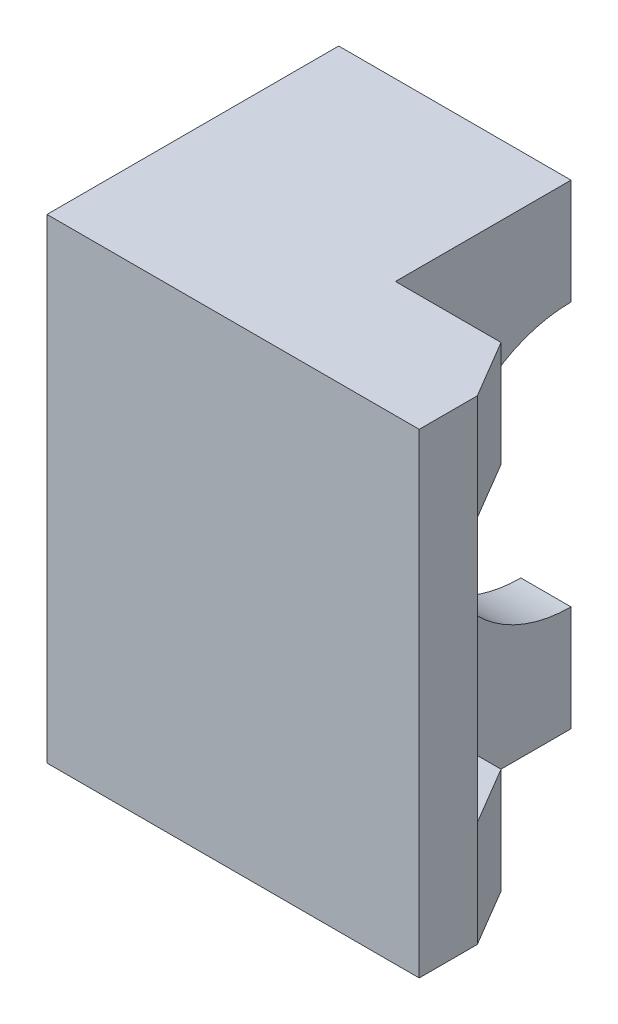
ISO-10303-21;
HEADER;
FILE_DESCRIPTION(('STEP AP214'),'2;1');
FILE_NAME('part.step','',(''),(''),'','','');
FILE_SCHEMA(('AUTOMOTIVE_DESIGN { 1 0 10303 214 1 1 1 1 }'));
ENDSEC;
DATA;
#1=APPLICATION_CONTEXT('core data for automotive mechanical design processes');
#2=APPLICATION_PROTOCOL_DEFINITION('international standard','automotive_design',2000,#1);
#3=PRODUCT_CONTEXT('',#1,'mechanical');
#4=PRODUCT('Part','Part','',(#3));
#5=PRODUCT_RELATED_PRODUCT_CATEGORY('part','',(#4));
#6=PRODUCT_DEFINITION_FORMATION('','',#4);
#7=PRODUCT_DEFINITION_CONTEXT('part definition',#1,'design');
#8=PRODUCT_DEFINITION('design','',#6,#7);
#9=PRODUCT_DEFINITION_SHAPE('','',#8);
#10=(LENGTH_UNIT() NAMED_UNIT(*) SI_UNIT(.MILLI.,.METRE.));
#11=(NAMED_UNIT(*) PLANE_ANGLE_UNIT() SI_UNIT($,.RADIAN.));
#12=(NAMED_UNIT(*) SI_UNIT($,.STERADIAN.) SOLID_ANGLE_UNIT());
#13=UNCERTAINTY_MEASURE_WITH_UNIT(LENGTH_MEASURE(1.E-05),#10,'distance_accuracy_value','');
#14=(GEOMETRIC_REPRESENTATION_CONTEXT(3) GLOBAL_UNCERTAINTY_ASSIGNED_CONTEXT((#13)) GLOBAL_UNIT_ASSIGNED_CONTEXT((#10,
#11,#12)) REPRESENTATION_CONTEXT('',''));
#15=CARTESIAN_POINT('',(0.,0.,0.));
#16=DIRECTION('',(0.,0.,1.));
#17=DIRECTION('',(1.,0.,0.));
#18=AXIS2_PLACEMENT_3D('',#15,#16,#17);
#19=CARTESIAN_POINT('',(70.5,90.,-11.));
#20=DIRECTION('',(-0.860926528214316,0.,0.508729312126641));
#21=DIRECTION('',(0.508729312126641,0.,0.860926528214316));
#22=AXIS2_PLACEMENT_3D('',#19,#20,#21);
#23=PLANE('',#22);
#24=DIRECTION('',(0.508729312126641,0.,0.860926528214316));
#25=VECTOR('',#24,1.);
#26=CARTESIAN_POINT('',(70.5,70.,-11.));
#27=LINE('',#26,#25);
#28=CARTESIAN_POINT('',(64.,70.,-22.));
#29=VERTEX_POINT('',#28);
#30=CARTESIAN_POINT('',(70.5,70.,-11.));
#31=VERTEX_POINT('',#30);
#32=EDGE_CURVE('E11',#29,#31,#27,.T.);
#33=ORIENTED_EDGE('',*,*,#32,.F.);
#34=DIRECTION('',(0.,-1.,0.));
#35=VECTOR('',#34,1.);
#36=CARTESIAN_POINT('',(64.,90.,-22.));
#37=LINE('',#36,#35);
#38=CARTESIAN_POINT('',(64.,90.,-22.));
#39=VERTEX_POINT('',#38);
#40=EDGE_CURVE('E214',#39,#29,#37,.T.);
#41=ORIENTED_EDGE('',*,*,#40,.F.);
#42=DIRECTION('',(-0.508729312126641,0.,-0.860926528214316));
#43=VECTOR('',#42,1.);
#44=CARTESIAN_POINT('',(70.5,90.,-11.));
#45=LINE('',#44,#43);
#46=CARTESIAN_POINT('',(70.5,90.,-11.));
#47=VERTEX_POINT('',#46);
#48=EDGE_CURVE('E324',#47,#39,#45,.T.);
#49=ORIENTED_EDGE('',*,*,#48,.F.);
#50=DIRECTION('',(0.,-1.,0.));
#51=VECTOR('',#50,1.);
#52=CARTESIAN_POINT('',(70.5,90.,-11.));
#53=LINE('',#52,#51);
#54=EDGE_CURVE('E212',#47,#31,#53,.T.);
#55=ORIENTED_EDGE('',*,*,#54,.T.);
#56=EDGE_LOOP('',(#33,#41,#49,#55));
#57=FACE_BOUND('',#56,.T.);
#58=ADVANCED_FACE('F39',(#57),#23,.F.);
#59=DIRECTION('',(-0.508729312126641,0.,-0.860926528214316));
#60=VECTOR('',#59,1.);
#61=CARTESIAN_POINT('',(70.5,20.,-11.));
#62=LINE('',#61,#60);
#63=CARTESIAN_POINT('',(70.5,20.,-11.));
#64=VERTEX_POINT('',#63);
#65=CARTESIAN_POINT('',(64.,20.,-22.));
#66=VERTEX_POINT('',#65);
#67=EDGE_CURVE('E50',#64,#66,#62,.T.);
#68=ORIENTED_EDGE('',*,*,#67,.F.);
#69=CARTESIAN_POINT('',(70.5,0.,-11.));
#70=VERTEX_POINT('',#69);
#71=EDGE_CURVE('E202',#64,#70,#53,.T.);
#72=ORIENTED_EDGE('',*,*,#71,.T.);
#73=DIRECTION('',(-0.508729312126641,0.,-0.860926528214316));
#74=VECTOR('',#73,1.);
#75=CARTESIAN_POINT('',(70.5,0.,-11.));
#76=LINE('',#75,#74);
#77=CARTESIAN_POINT('',(64.,0.,-22.));
#78=VERTEX_POINT('',#77);
#79=EDGE_CURVE('E337',#70,#78,#76,.T.);
#80=ORIENTED_EDGE('',*,*,#79,.T.);
#81=EDGE_CURVE('E210',#66,#78,#37,.T.);
#82=ORIENTED_EDGE('',*,*,#81,.F.);
#83=EDGE_LOOP('',(#68,#72,#80,#82));
#84=FACE_BOUND('',#83,.T.);
#85=ADVANCED_FACE('F201',(#84),#23,.F.);
#86=CARTESIAN_POINT('',(202.719546783785,45.,-55.25));
#87=DIRECTION('',(-1.,0.,0.));
#88=DIRECTION('',(0.,0.,1.));
#89=AXIS2_PLACEMENT_3D('',#86,#87,#88);
#90=CYLINDRICAL_SURFACE('',#89,25.);
#91=CARTESIAN_POINT('',(9.50000000000001,45.,-55.25));
#92=DIRECTION('',(1.,0.,0.));
#93=DIRECTION('',(0.,1.,0.));
#94=AXIS2_PLACEMENT_3D('',#91,#92,#93);
#95=CIRCLE('',#94,25.);
#96=CARTESIAN_POINT('',(9.5,65.,-40.25));
#97=VERTEX_POINT('',#96);
#98=CARTESIAN_POINT('',(9.50000000000001,70.,-55.25));
#99=VERTEX_POINT('',#98);
#100=EDGE_CURVE('E249',#97,#99,#95,.F.);
#101=ORIENTED_EDGE('',*,*,#100,.F.);
#102=DIRECTION('',(-1.,0.,0.));
#103=VECTOR('',#102,1.);
#104=CARTESIAN_POINT('',(202.719546783785,65.,-40.25));
#105=LINE('',#104,#103);
#106=CARTESIAN_POINT('',(34.5,65.,-40.25));
#107=VERTEX_POINT('',#106);
#108=EDGE_CURVE('E243',#97,#107,#105,.F.);
#109=ORIENTED_EDGE('',*,*,#108,.T.);
#110=CARTESIAN_POINT('',(34.5,45.,-55.25));
#111=DIRECTION('',(1.,0.,0.));
#112=DIRECTION('',(0.,0.,-1.));
#113=AXIS2_PLACEMENT_3D('',#110,#111,#112);
#114=CIRCLE('',#113,25.);
#115=CARTESIAN_POINT('',(34.5,70.,-55.25));
#116=VERTEX_POINT('',#115);
#117=EDGE_CURVE('E244',#107,#116,#114,.F.);
#118=ORIENTED_EDGE('',*,*,#117,.T.);
#119=DIRECTION('',(-1.,0.,0.));
#120=VECTOR('',#119,1.);
#121=CARTESIAN_POINT('',(202.719546783785,70.,-55.25));
#122=LINE('',#121,#120);
#123=CARTESIAN_POINT('',(44.,70.,-55.25));
#124=VERTEX_POINT('',#123);
#125=EDGE_CURVE('E303',#124,#116,#122,.T.);
#126=ORIENTED_EDGE('',*,*,#125,.F.);
#127=CARTESIAN_POINT('',(44.,45.,-55.25));
#128=DIRECTION('',(-1.,0.,0.));
#129=DIRECTION('',(0.,0.,1.));
#130=AXIS2_PLACEMENT_3D('',#127,#128,#129);
#131=CIRCLE('',#130,25.);
#132=CARTESIAN_POINT('',(44.,20.,-55.25));
#133=VERTEX_POINT('',#132);
#134=EDGE_CURVE('E283',#124,#133,#131,.F.);
#135=ORIENTED_EDGE('',*,*,#134,.T.);
#136=DIRECTION('',(-1.,0.,0.));
#137=VECTOR('',#136,1.);
#138=CARTESIAN_POINT('',(202.719546783785,20.,-55.25));
#139=LINE('',#138,#137);
#140=CARTESIAN_POINT('',(34.5,20.,-55.25));
#141=VERTEX_POINT('',#140);
#142=EDGE_CURVE('E310',#133,#141,#139,.T.);
#143=ORIENTED_EDGE('',*,*,#142,.T.);
#144=CARTESIAN_POINT('',(34.5,45.,-55.25));
#145=DIRECTION('',(-1.,0.,0.));
#146=DIRECTION('',(0.,0.,1.));
#147=AXIS2_PLACEMENT_3D('',#144,#145,#146);
#148=CIRCLE('',#147,25.);
#149=CARTESIAN_POINT('',(34.5,25.,-40.25));
#150=VERTEX_POINT('',#149);
#151=EDGE_CURVE('E239',#150,#141,#148,.F.);
#152=ORIENTED_EDGE('',*,*,#151,.F.);
#153=DIRECTION('',(-1.,0.,0.));
#154=VECTOR('',#153,1.);
#155=CARTESIAN_POINT('',(202.719546783785,25.,-40.25));
#156=LINE('',#155,#154);
#157=CARTESIAN_POINT('',(9.49999999999998,25.,-40.25));
#158=VERTEX_POINT('',#157);
#159=EDGE_CURVE('E231',#158,#150,#156,.F.);
#160=ORIENTED_EDGE('',*,*,#159,.F.);
#161=CARTESIAN_POINT('',(9.50000000000001,45.,-55.25));
#162=DIRECTION('',(-1.,0.,0.));
#163=DIRECTION('',(0.,-1.,0.));
#164=AXIS2_PLACEMENT_3D('',#161,#162,#163);
#165=CIRCLE('',#164,25.);
#166=CARTESIAN_POINT('',(9.50000000000001,20.,-55.25));
#167=VERTEX_POINT('',#166);
#168=EDGE_CURVE('E237',#158,#167,#165,.F.);
#169=ORIENTED_EDGE('',*,*,#168,.T.);
#170=CARTESIAN_POINT('',(0.,20.,-55.25));
#171=VERTEX_POINT('',#170);
#172=EDGE_CURVE('E306',#167,#171,#139,.T.);
#173=ORIENTED_EDGE('',*,*,#172,.T.);
#174=CARTESIAN_POINT('',(0.,45.,-55.25));
#175=DIRECTION('',(-1.,0.,0.));
#176=DIRECTION('',(0.,0.,1.));
#177=AXIS2_PLACEMENT_3D('',#174,#175,#176);
#178=CIRCLE('',#177,25.);
#179=CARTESIAN_POINT('',(0.,70.,-55.25));
#180=VERTEX_POINT('',#179);
#181=EDGE_CURVE('E297',#180,#171,#178,.F.);
#182=ORIENTED_EDGE('',*,*,#181,.F.);
#183=EDGE_CURVE('E305',#99,#180,#122,.T.);
#184=ORIENTED_EDGE('',*,*,#183,.F.);
#185=EDGE_LOOP('',(#101,#109,#118,#126,#135,#143,#152,#160,#169,#173,#182,#184));
#186=FACE_BOUND('',#185,.T.);
#187=ADVANCED_FACE('F365',(#186),#90,.F.);
#188=CARTESIAN_POINT('',(44.,90.,-55.25));
#189=DIRECTION('',(0.,0.,1.));
#190=DIRECTION('',(1.,0.,0.));
#191=AXIS2_PLACEMENT_3D('',#188,#189,#190);
#192=PLANE('',#191);
#193=DIRECTION('',(-1.,0.,0.));
#194=VECTOR('',#193,1.);
#195=CARTESIAN_POINT('',(34.5,11.5,-55.25));
#196=LINE('',#195,#194);
#197=CARTESIAN_POINT('',(34.5,11.5,-55.25));
#198=VERTEX_POINT('',#197);
#199=CARTESIAN_POINT('',(9.49999999999999,11.5,-55.25));
#200=VERTEX_POINT('',#199);
#201=EDGE_CURVE('E287',#198,#200,#196,.T.);
#202=ORIENTED_EDGE('',*,*,#201,.F.);
#203=DIRECTION('',(0.,1.,0.));
#204=VECTOR('',#203,1.);
#205=CARTESIAN_POINT('',(34.5,11.5,-55.25));
#206=LINE('',#205,#204);
#207=EDGE_CURVE('E273',#198,#141,#206,.T.);
#208=ORIENTED_EDGE('',*,*,#207,.T.);
#209=ORIENTED_EDGE('',*,*,#142,.F.);
#210=DIRECTION('',(0.,-1.,0.));
#211=VECTOR('',#210,1.);
#212=CARTESIAN_POINT('',(44.,90.,-55.25));
#213=LINE('',#212,#211);
#214=CARTESIAN_POINT('',(44.,0.,-55.25));
#215=VERTEX_POINT('',#214);
#216=EDGE_CURVE('E227',#133,#215,#213,.T.);
#217=ORIENTED_EDGE('',*,*,#216,.T.);
#218=DIRECTION('',(-1.,0.,0.));
#219=VECTOR('',#218,1.);
#220=CARTESIAN_POINT('',(44.,0.,-55.25));
#221=LINE('',#220,#219);
#222=CARTESIAN_POINT('',(0.,0.,-55.25));
#223=VERTEX_POINT('',#222);
#224=EDGE_CURVE('E335',#215,#223,#221,.T.);
#225=ORIENTED_EDGE('',*,*,#224,.T.);
#226=DIRECTION('',(0.,-1.,0.));
#227=VECTOR('',#226,1.);
#228=CARTESIAN_POINT('',(0.,90.,-55.25));
#229=LINE('',#228,#227);
#230=EDGE_CURVE('E228',#171,#223,#229,.T.);
#231=ORIENTED_EDGE('',*,*,#230,.F.);
#232=ORIENTED_EDGE('',*,*,#172,.F.);
#233=DIRECTION('',(0.,1.,0.));
#234=VECTOR('',#233,1.);
#235=CARTESIAN_POINT('',(9.49999999999999,11.5,-55.25));
#236=LINE('',#235,#234);
#237=EDGE_CURVE('E286',#200,#167,#236,.T.);
#238=ORIENTED_EDGE('',*,*,#237,.F.);
#239=EDGE_LOOP('',(#202,#208,#209,#217,#225,#231,#232,#238));
#240=FACE_BOUND('',#239,.T.);
#241=ADVANCED_FACE('F356',(#240),#192,.F.);
#242=CARTESIAN_POINT('',(44.,90.,-22.));
#243=DIRECTION('',(-1.,0.,0.));
#244=DIRECTION('',(0.,0.,1.));
#245=AXIS2_PLACEMENT_3D('',#242,#243,#244);
#246=PLANE('',#245);
#247=ORIENTED_EDGE('',*,*,#134,.F.);
#248=CARTESIAN_POINT('',(44.,90.,-55.25));
#249=VERTEX_POINT('',#248);
#250=EDGE_CURVE('E232',#249,#124,#213,.T.);
#251=ORIENTED_EDGE('',*,*,#250,.F.);
#252=DIRECTION('',(0.,0.,-1.));
#253=VECTOR('',#252,1.);
#254=CARTESIAN_POINT('',(44.,90.,-22.));
#255=LINE('',#254,#253);
#256=CARTESIAN_POINT('',(44.,90.,-22.));
#257=VERTEX_POINT('',#256);
#258=EDGE_CURVE('E311',#257,#249,#255,.T.);
#259=ORIENTED_EDGE('',*,*,#258,.F.);
#260=DIRECTION('',(0.,-1.,0.));
#261=VECTOR('',#260,1.);
#262=CARTESIAN_POINT('',(44.,90.,-22.));
#263=LINE('',#262,#261);
#264=CARTESIAN_POINT('',(44.,0.,-22.));
#265=VERTEX_POINT('',#264);
#266=EDGE_CURVE('E328',#257,#265,#263,.T.);
#267=ORIENTED_EDGE('',*,*,#266,.T.);
#268=DIRECTION('',(0.,0.,-1.));
#269=VECTOR('',#268,1.);
#270=CARTESIAN_POINT('',(44.,0.,-22.));
#271=LINE('',#270,#269);
#272=EDGE_CURVE('E315',#265,#215,#271,.T.);
#273=ORIENTED_EDGE('',*,*,#272,.T.);
#274=ORIENTED_EDGE('',*,*,#216,.F.);
#275=EDGE_LOOP('',(#247,#251,#259,#267,#273,#274));
#276=FACE_BOUND('',#275,.T.);
#277=ADVANCED_FACE('F41',(#276),#246,.F.);
#278=DIRECTION('',(-1.,0.,0.));
#279=VECTOR('',#278,1.);
#280=CARTESIAN_POINT('',(34.5,78.5,-55.25));
#281=LINE('',#280,#279);
#282=CARTESIAN_POINT('',(34.5,78.5,-55.25));
#283=VERTEX_POINT('',#282);
#284=CARTESIAN_POINT('',(9.5,78.5,-55.25));
#285=VERTEX_POINT('',#284);
#286=EDGE_CURVE('E266',#283,#285,#281,.T.);
#287=ORIENTED_EDGE('',*,*,#286,.T.);
#288=DIRECTION('',(0.,-1.,0.));
#289=VECTOR('',#288,1.);
#290=CARTESIAN_POINT('',(9.5,78.5,-55.25));
#291=LINE('',#290,#289);
#292=EDGE_CURVE('E271',#285,#99,#291,.T.);
#293=ORIENTED_EDGE('',*,*,#292,.T.);
#294=ORIENTED_EDGE('',*,*,#183,.T.);
#295=CARTESIAN_POINT('',(0.,90.,-55.25));
#296=VERTEX_POINT('',#295);
#297=EDGE_CURVE('E230',#296,#180,#229,.T.);
#298=ORIENTED_EDGE('',*,*,#297,.F.);
#299=DIRECTION('',(-1.,0.,0.));
#300=VECTOR('',#299,1.);
#301=CARTESIAN_POINT('',(44.,90.,-55.25));
#302=LINE('',#301,#300);
#303=EDGE_CURVE('E316',#249,#296,#302,.T.);
#304=ORIENTED_EDGE('',*,*,#303,.F.);
#305=ORIENTED_EDGE('',*,*,#250,.T.);
#306=ORIENTED_EDGE('',*,*,#125,.T.);
#307=DIRECTION('',(0.,-1.,0.));
#308=VECTOR('',#307,1.);
#309=CARTESIAN_POINT('',(34.5,78.5,-55.25));
#310=LINE('',#309,#308);
#311=EDGE_CURVE('E272',#283,#116,#310,.T.);
#312=ORIENTED_EDGE('',*,*,#311,.F.);
#313=EDGE_LOOP('',(#287,#293,#294,#298,#304,#305,#306,#312));
#314=FACE_BOUND('',#313,.T.);
#315=ADVANCED_FACE('F366',(#314),#192,.F.);
#316=CARTESIAN_POINT('',(0.,90.,-55.25));
#317=DIRECTION('',(1.,0.,0.));
#318=DIRECTION('',(0.,0.,-1.));
#319=AXIS2_PLACEMENT_3D('',#316,#317,#318);
#320=PLANE('',#319);
#321=ORIENTED_EDGE('',*,*,#297,.T.);
#322=ORIENTED_EDGE('',*,*,#181,.T.);
#323=ORIENTED_EDGE('',*,*,#230,.T.);
#324=DIRECTION('',(0.,0.,1.));
#325=VECTOR('',#324,1.);
#326=CARTESIAN_POINT('',(0.,0.,-55.25));
#327=LINE('',#326,#325);
#328=CARTESIAN_POINT('',(0.,0.,0.));
#329=VERTEX_POINT('',#328);
#330=EDGE_CURVE('E333',#223,#329,#327,.T.);
#331=ORIENTED_EDGE('',*,*,#330,.T.);
#332=DIRECTION('',(0.,-1.,0.));
#333=VECTOR('',#332,1.);
#334=CARTESIAN_POINT('',(0.,90.,0.));
#335=LINE('',#334,#333);
#336=CARTESIAN_POINT('',(0.,90.,0.));
#337=VERTEX_POINT('',#336);
#338=EDGE_CURVE('E224',#337,#329,#335,.T.);
#339=ORIENTED_EDGE('',*,*,#338,.F.);
#340=DIRECTION('',(0.,0.,1.));
#341=VECTOR('',#340,1.);
#342=CARTESIAN_POINT('',(0.,90.,-55.25));
#343=LINE('',#342,#341);
#344=EDGE_CURVE('E317',#296,#337,#343,.T.);
#345=ORIENTED_EDGE('',*,*,#344,.F.);
#346=EDGE_LOOP('',(#321,#322,#323,#331,#339,#345));
#347=FACE_BOUND('',#346,.T.);
#348=ADVANCED_FACE('F406',(#347),#320,.F.);
#349=CARTESIAN_POINT('',(0.,90.,0.));
#350=DIRECTION('',(0.,0.,-1.));
#351=DIRECTION('',(-1.,0.,0.));
#352=AXIS2_PLACEMENT_3D('',#349,#350,#351);
#353=PLANE('',#352);
#354=DIRECTION('',(1.,0.,0.));
#355=VECTOR('',#354,1.);
#356=CARTESIAN_POINT('',(0.,0.,0.));
#357=LINE('',#356,#355);
#358=CARTESIAN_POINT('',(70.5,0.,0.));
#359=VERTEX_POINT('',#358);
#360=EDGE_CURVE('E340',#329,#359,#357,.T.);
#361=ORIENTED_EDGE('',*,*,#360,.T.);
#362=DIRECTION('',(0.,-1.,0.));
#363=VECTOR('',#362,1.);
#364=CARTESIAN_POINT('',(70.5,90.,0.));
#365=LINE('',#364,#363);
#366=CARTESIAN_POINT('',(70.5,90.,0.));
#367=VERTEX_POINT('',#366);
#368=EDGE_CURVE('E220',#367,#359,#365,.T.);
#369=ORIENTED_EDGE('',*,*,#368,.F.);
#370=DIRECTION('',(1.,0.,0.));
#371=VECTOR('',#370,1.);
#372=CARTESIAN_POINT('',(0.,90.,0.));
#373=LINE('',#372,#371);
#374=EDGE_CURVE('E321',#337,#367,#373,.T.);
#375=ORIENTED_EDGE('',*,*,#374,.F.);
#376=ORIENTED_EDGE('',*,*,#338,.T.);
#377=EDGE_LOOP('',(#361,#369,#375,#376));
#378=FACE_BOUND('',#377,.T.);
#379=ADVANCED_FACE('F403',(#378),#353,.F.);
#380=CARTESIAN_POINT('',(70.5,90.,0.));
#381=DIRECTION('',(-1.,0.,0.));
#382=DIRECTION('',(0.,0.,1.));
#383=AXIS2_PLACEMENT_3D('',#380,#381,#382);
#384=PLANE('',#383);
#385=DIRECTION('',(0.,0.,-1.));
#386=VECTOR('',#385,1.);
#387=CARTESIAN_POINT('',(70.5,0.,0.));
#388=LINE('',#387,#386);
#389=EDGE_CURVE('E215',#359,#70,#388,.T.);
#390=ORIENTED_EDGE('',*,*,#389,.T.);
#391=ORIENTED_EDGE('',*,*,#71,.F.);
#392=DIRECTION('',(0.,-1.,0.));
#393=VECTOR('',#392,1.);
#394=CARTESIAN_POINT('',(70.5,70.,-11.));
#395=LINE('',#394,#393);
#396=EDGE_CURVE('E189',#31,#64,#395,.T.);
#397=ORIENTED_EDGE('',*,*,#396,.F.);
#398=ORIENTED_EDGE('',*,*,#54,.F.);
#399=DIRECTION('',(0.,0.,-1.));
#400=VECTOR('',#399,1.);
#401=CARTESIAN_POINT('',(70.5,90.,0.));
#402=LINE('',#401,#400);
#403=EDGE_CURVE('E323',#367,#47,#402,.T.);
#404=ORIENTED_EDGE('',*,*,#403,.F.);
#405=ORIENTED_EDGE('',*,*,#368,.T.);
#406=EDGE_LOOP('',(#390,#391,#397,#398,#404,#405));
#407=FACE_BOUND('',#406,.T.);
#408=ADVANCED_FACE('F207',(#407),#384,.F.);
#409=CARTESIAN_POINT('',(64.,90.,-22.));
#410=DIRECTION('',(0.,0.,1.));
#411=DIRECTION('',(1.,0.,0.));
#412=AXIS2_PLACEMENT_3D('',#409,#410,#411);
#413=PLANE('',#412);
#414=DIRECTION('',(0.,-1.,0.));
#415=VECTOR('',#414,1.);
#416=CARTESIAN_POINT('',(54.,70.,-22.));
#417=LINE('',#416,#415);
#418=CARTESIAN_POINT('',(54.,70.,-22.));
#419=VERTEX_POINT('',#418);
#420=CARTESIAN_POINT('',(54.,20.,-22.));
#421=VERTEX_POINT('',#420);
#422=EDGE_CURVE('E200',#419,#421,#417,.T.);
#423=ORIENTED_EDGE('',*,*,#422,.T.);
#424=DIRECTION('',(1.,0.,0.));
#425=VECTOR('',#424,1.);
#426=CARTESIAN_POINT('',(54.,20.,-22.));
#427=LINE('',#426,#425);
#428=EDGE_CURVE('E53',#421,#66,#427,.T.);
#429=ORIENTED_EDGE('',*,*,#428,.T.);
#430=ORIENTED_EDGE('',*,*,#81,.T.);
#431=DIRECTION('',(-1.,0.,0.));
#432=VECTOR('',#431,1.);
#433=CARTESIAN_POINT('',(64.,0.,-22.));
#434=LINE('',#433,#432);
#435=EDGE_CURVE('E320',#78,#265,#434,.T.);
#436=ORIENTED_EDGE('',*,*,#435,.T.);
#437=ORIENTED_EDGE('',*,*,#266,.F.);
#438=DIRECTION('',(-1.,0.,0.));
#439=VECTOR('',#438,1.);
#440=CARTESIAN_POINT('',(64.,90.,-22.));
#441=LINE('',#440,#439);
#442=EDGE_CURVE('E330',#39,#257,#441,.T.);
#443=ORIENTED_EDGE('',*,*,#442,.F.);
#444=ORIENTED_EDGE('',*,*,#40,.T.);
#445=DIRECTION('',(-1.,0.,0.));
#446=VECTOR('',#445,1.);
#447=CARTESIAN_POINT('',(70.5,70.,-22.));
#448=LINE('',#447,#446);
#449=EDGE_CURVE('E208',#29,#419,#448,.T.);
#450=ORIENTED_EDGE('',*,*,#449,.T.);
#451=EDGE_LOOP('',(#423,#429,#430,#436,#437,#443,#444,#450));
#452=FACE_BOUND('',#451,.T.);
#453=ADVANCED_FACE('F350',(#452),#413,.F.);
#454=CARTESIAN_POINT('',(0.,90.,0.));
#455=DIRECTION('',(0.,1.,0.));
#456=DIRECTION('',(0.,0.,1.));
#457=AXIS2_PLACEMENT_3D('',#454,#455,#456);
#458=PLANE('',#457);
#459=ORIENTED_EDGE('',*,*,#258,.T.);
#460=ORIENTED_EDGE('',*,*,#303,.T.);
#461=ORIENTED_EDGE('',*,*,#344,.T.);
#462=ORIENTED_EDGE('',*,*,#374,.T.);
#463=ORIENTED_EDGE('',*,*,#403,.T.);
#464=ORIENTED_EDGE('',*,*,#48,.T.);
#465=ORIENTED_EDGE('',*,*,#442,.T.);
#466=EDGE_LOOP('',(#459,#460,#461,#462,#463,#464,#465));
#467=FACE_BOUND('',#466,.T.);
#468=ADVANCED_FACE('F371',(#467),#458,.T.);
#469=CARTESIAN_POINT('',(0.,0.,0.));
#470=DIRECTION('',(0.,1.,0.));
#471=DIRECTION('',(0.,0.,1.));
#472=AXIS2_PLACEMENT_3D('',#469,#470,#471);
#473=PLANE('',#472);
#474=ORIENTED_EDGE('',*,*,#272,.F.);
#475=ORIENTED_EDGE('',*,*,#435,.F.);
#476=ORIENTED_EDGE('',*,*,#79,.F.);
#477=ORIENTED_EDGE('',*,*,#389,.F.);
#478=ORIENTED_EDGE('',*,*,#360,.F.);
#479=ORIENTED_EDGE('',*,*,#330,.F.);
#480=ORIENTED_EDGE('',*,*,#224,.F.);
#481=EDGE_LOOP('',(#474,#475,#476,#477,#478,#479,#480));
#482=FACE_BOUND('',#481,.T.);
#483=ADVANCED_FACE('F348',(#482),#473,.F.);
#484=CARTESIAN_POINT('',(34.5,11.5,-40.25));
#485=DIRECTION('',(-1.,0.,0.));
#486=DIRECTION('',(0.,0.,1.));
#487=AXIS2_PLACEMENT_3D('',#484,#485,#486);
#488=PLANE('',#487);
#489=ORIENTED_EDGE('',*,*,#151,.T.);
#490=ORIENTED_EDGE('',*,*,#207,.F.);
#491=DIRECTION('',(0.,0.,-1.));
#492=VECTOR('',#491,1.);
#493=CARTESIAN_POINT('',(34.5,11.5,-40.25));
#494=LINE('',#493,#492);
#495=CARTESIAN_POINT('',(34.5,11.5,-40.25));
#496=VERTEX_POINT('',#495);
#497=EDGE_CURVE('E281',#496,#198,#494,.T.);
#498=ORIENTED_EDGE('',*,*,#497,.F.);
#499=DIRECTION('',(0.,1.,0.));
#500=VECTOR('',#499,1.);
#501=CARTESIAN_POINT('',(34.5,11.5,-40.25));
#502=LINE('',#501,#500);
#503=EDGE_CURVE('E288',#496,#150,#502,.T.);
#504=ORIENTED_EDGE('',*,*,#503,.T.);
#505=EDGE_LOOP('',(#489,#490,#498,#504));
#506=FACE_BOUND('',#505,.T.);
#507=ADVANCED_FACE('F429',(#506),#488,.T.);
#508=CARTESIAN_POINT('',(9.49999999999999,11.5,-40.25));
#509=DIRECTION('',(-1.,0.,0.));
#510=DIRECTION('',(0.,-1.,0.));
#511=AXIS2_PLACEMENT_3D('',#508,#509,#510);
#512=PLANE('',#511);
#513=DIRECTION('',(0.,1.,0.));
#514=VECTOR('',#513,1.);
#515=CARTESIAN_POINT('',(9.49999999999999,11.5,-40.25));
#516=LINE('',#515,#514);
#517=CARTESIAN_POINT('',(9.49999999999999,11.5,-40.25));
#518=VERTEX_POINT('',#517);
#519=EDGE_CURVE('E298',#518,#158,#516,.T.);
#520=ORIENTED_EDGE('',*,*,#519,.F.);
#521=DIRECTION('',(0.,0.,-1.));
#522=VECTOR('',#521,1.);
#523=CARTESIAN_POINT('',(9.49999999999999,11.5,-40.25));
#524=LINE('',#523,#522);
#525=EDGE_CURVE('E265',#518,#200,#524,.T.);
#526=ORIENTED_EDGE('',*,*,#525,.T.);
#527=ORIENTED_EDGE('',*,*,#237,.T.);
#528=ORIENTED_EDGE('',*,*,#168,.F.);
#529=EDGE_LOOP('',(#520,#526,#527,#528));
#530=FACE_BOUND('',#529,.T.);
#531=ADVANCED_FACE('F433',(#530),#512,.F.);
#532=CARTESIAN_POINT('',(0.,0.,-40.25));
#533=DIRECTION('',(0.,0.,-1.));
#534=DIRECTION('',(-1.,0.,0.));
#535=AXIS2_PLACEMENT_3D('',#532,#533,#534);
#536=PLANE('',#535);
#537=ORIENTED_EDGE('',*,*,#159,.T.);
#538=ORIENTED_EDGE('',*,*,#503,.F.);
#539=DIRECTION('',(-1.,0.,0.));
#540=VECTOR('',#539,1.);
#541=CARTESIAN_POINT('',(34.5,11.5,-40.25));
#542=LINE('',#541,#540);
#543=EDGE_CURVE('E282',#496,#518,#542,.T.);
#544=ORIENTED_EDGE('',*,*,#543,.T.);
#545=ORIENTED_EDGE('',*,*,#519,.T.);
#546=EDGE_LOOP('',(#537,#538,#544,#545));
#547=FACE_BOUND('',#546,.T.);
#548=ADVANCED_FACE('F426',(#547),#536,.T.);
#549=CARTESIAN_POINT('',(34.5,11.5,-40.25));
#550=DIRECTION('',(0.,-1.,0.));
#551=DIRECTION('',(0.,0.,-1.));
#552=AXIS2_PLACEMENT_3D('',#549,#550,#551);
#553=PLANE('',#552);
#554=ORIENTED_EDGE('',*,*,#201,.T.);
#555=ORIENTED_EDGE('',*,*,#525,.F.);
#556=ORIENTED_EDGE('',*,*,#543,.F.);
#557=ORIENTED_EDGE('',*,*,#497,.T.);
#558=EDGE_LOOP('',(#554,#555,#556,#557));
#559=FACE_BOUND('',#558,.T.);
#560=ADVANCED_FACE('F441',(#559),#553,.F.);
#561=CARTESIAN_POINT('',(9.5,78.5,-40.25));
#562=DIRECTION('',(1.,0.,0.));
#563=DIRECTION('',(0.,1.,0.));
#564=AXIS2_PLACEMENT_3D('',#561,#562,#563);
#565=PLANE('',#564);
#566=ORIENTED_EDGE('',*,*,#100,.T.);
#567=ORIENTED_EDGE('',*,*,#292,.F.);
#568=DIRECTION('',(0.,0.,-1.));
#569=VECTOR('',#568,1.);
#570=CARTESIAN_POINT('',(9.5,78.5,-40.25));
#571=LINE('',#570,#569);
#572=CARTESIAN_POINT('',(9.5,78.5,-40.25));
#573=VERTEX_POINT('',#572);
#574=EDGE_CURVE('E269',#573,#285,#571,.T.);
#575=ORIENTED_EDGE('',*,*,#574,.F.);
#576=DIRECTION('',(0.,-1.,0.));
#577=VECTOR('',#576,1.);
#578=CARTESIAN_POINT('',(9.5,78.5,-40.25));
#579=LINE('',#578,#577);
#580=EDGE_CURVE('E262',#573,#97,#579,.T.);
#581=ORIENTED_EDGE('',*,*,#580,.T.);
#582=EDGE_LOOP('',(#566,#567,#575,#581));
#583=FACE_BOUND('',#582,.T.);
#584=ADVANCED_FACE('F445',(#583),#565,.T.);
#585=CARTESIAN_POINT('',(34.5,78.5,-40.25));
#586=DIRECTION('',(1.,0.,0.));
#587=DIRECTION('',(0.,0.,-1.));
#588=AXIS2_PLACEMENT_3D('',#585,#586,#587);
#589=PLANE('',#588);
#590=DIRECTION('',(0.,-1.,0.));
#591=VECTOR('',#590,1.);
#592=CARTESIAN_POINT('',(34.5,78.5,-40.25));
#593=LINE('',#592,#591);
#594=CARTESIAN_POINT('',(34.5,78.5,-40.25));
#595=VERTEX_POINT('',#594);
#596=EDGE_CURVE('E65',#595,#107,#593,.T.);
#597=ORIENTED_EDGE('',*,*,#596,.F.);
#598=DIRECTION('',(0.,0.,-1.));
#599=VECTOR('',#598,1.);
#600=CARTESIAN_POINT('',(34.5,78.5,-40.25));
#601=LINE('',#600,#599);
#602=EDGE_CURVE('E276',#595,#283,#601,.T.);
#603=ORIENTED_EDGE('',*,*,#602,.T.);
#604=ORIENTED_EDGE('',*,*,#311,.T.);
#605=ORIENTED_EDGE('',*,*,#117,.F.);
#606=EDGE_LOOP('',(#597,#603,#604,#605));
#607=FACE_BOUND('',#606,.T.);
#608=ADVANCED_FACE('F452',(#607),#589,.F.);
#609=CARTESIAN_POINT('',(0.,0.,-40.25));
#610=DIRECTION('',(0.,0.,1.));
#611=DIRECTION('',(1.,0.,0.));
#612=AXIS2_PLACEMENT_3D('',#609,#610,#611);
#613=PLANE('',#612);
#614=ORIENTED_EDGE('',*,*,#580,.F.);
#615=DIRECTION('',(-1.,0.,0.));
#616=VECTOR('',#615,1.);
#617=CARTESIAN_POINT('',(34.5,78.5,-40.25));
#618=LINE('',#617,#616);
#619=EDGE_CURVE('E268',#595,#573,#618,.T.);
#620=ORIENTED_EDGE('',*,*,#619,.F.);
#621=ORIENTED_EDGE('',*,*,#596,.T.);
#622=ORIENTED_EDGE('',*,*,#108,.F.);
#623=EDGE_LOOP('',(#614,#620,#621,#622));
#624=FACE_BOUND('',#623,.T.);
#625=ADVANCED_FACE('F464',(#624),#613,.F.);
#626=CARTESIAN_POINT('',(34.5,78.5,-40.25));
#627=DIRECTION('',(0.,-1.,0.));
#628=DIRECTION('',(0.,0.,-1.));
#629=AXIS2_PLACEMENT_3D('',#626,#627,#628);
#630=PLANE('',#629);
#631=ORIENTED_EDGE('',*,*,#286,.F.);
#632=ORIENTED_EDGE('',*,*,#602,.F.);
#633=ORIENTED_EDGE('',*,*,#619,.T.);
#634=ORIENTED_EDGE('',*,*,#574,.T.);
#635=EDGE_LOOP('',(#631,#632,#633,#634));
#636=FACE_BOUND('',#635,.T.);
#637=ADVANCED_FACE('F470',(#636),#630,.T.);
#638=CARTESIAN_POINT('',(70.5,70.,-11.));
#639=DIRECTION('',(0.,-1.,0.));
#640=DIRECTION('',(0.,0.,-1.));
#641=AXIS2_PLACEMENT_3D('',#638,#639,#640);
#642=PLANE('',#641);
#643=ORIENTED_EDGE('',*,*,#32,.T.);
#644=DIRECTION('',(-1.,0.,0.));
#645=VECTOR('',#644,1.);
#646=CARTESIAN_POINT('',(70.5,70.,-11.));
#647=LINE('',#646,#645);
#648=CARTESIAN_POINT('',(54.,70.,-11.));
#649=VERTEX_POINT('',#648);
#650=EDGE_CURVE('E191',#31,#649,#647,.T.);
#651=ORIENTED_EDGE('',*,*,#650,.T.);
#652=DIRECTION('',(0.,0.,-1.));
#653=VECTOR('',#652,1.);
#654=CARTESIAN_POINT('',(54.,70.,-11.));
#655=LINE('',#654,#653);
#656=EDGE_CURVE('E257',#649,#419,#655,.T.);
#657=ORIENTED_EDGE('',*,*,#656,.T.);
#658=ORIENTED_EDGE('',*,*,#449,.F.);
#659=EDGE_LOOP('',(#643,#651,#657,#658));
#660=FACE_BOUND('',#659,.T.);
#661=ADVANCED_FACE('F378',(#660),#642,.T.);
#662=CARTESIAN_POINT('',(54.,20.,-11.));
#663=DIRECTION('',(0.,1.,0.));
#664=DIRECTION('',(-1.,0.,0.));
#665=AXIS2_PLACEMENT_3D('',#662,#663,#664);
#666=PLANE('',#665);
#667=ORIENTED_EDGE('',*,*,#67,.T.);
#668=ORIENTED_EDGE('',*,*,#428,.F.);
#669=DIRECTION('',(0.,0.,-1.));
#670=VECTOR('',#669,1.);
#671=CARTESIAN_POINT('',(54.,20.,-11.));
#672=LINE('',#671,#670);
#673=CARTESIAN_POINT('',(54.,20.,-11.));
#674=VERTEX_POINT('',#673);
#675=EDGE_CURVE('E183',#674,#421,#672,.T.);
#676=ORIENTED_EDGE('',*,*,#675,.F.);
#677=DIRECTION('',(1.,0.,0.));
#678=VECTOR('',#677,1.);
#679=CARTESIAN_POINT('',(54.,20.,-11.));
#680=LINE('',#679,#678);
#681=EDGE_CURVE('E182',#674,#64,#680,.T.);
#682=ORIENTED_EDGE('',*,*,#681,.T.);
#683=EDGE_LOOP('',(#667,#668,#676,#682));
#684=FACE_BOUND('',#683,.T.);
#685=ADVANCED_FACE('F181',(#684),#666,.T.);
#686=CARTESIAN_POINT('',(54.,70.,-11.));
#687=DIRECTION('',(1.,0.,0.));
#688=DIRECTION('',(0.,1.,0.));
#689=AXIS2_PLACEMENT_3D('',#686,#687,#688);
#690=PLANE('',#689);
#691=ORIENTED_EDGE('',*,*,#422,.F.);
#692=ORIENTED_EDGE('',*,*,#656,.F.);
#693=DIRECTION('',(0.,-1.,0.));
#694=VECTOR('',#693,1.);
#695=CARTESIAN_POINT('',(54.,70.,-11.));
#696=LINE('',#695,#694);
#697=EDGE_CURVE('E186',#649,#674,#696,.T.);
#698=ORIENTED_EDGE('',*,*,#697,.T.);
#699=ORIENTED_EDGE('',*,*,#675,.T.);
#700=EDGE_LOOP('',(#691,#692,#698,#699));
#701=FACE_BOUND('',#700,.T.);
#702=ADVANCED_FACE('F385',(#701),#690,.T.);
#703=CARTESIAN_POINT('',(0.,0.,-11.));
#704=DIRECTION('',(0.,0.,1.));
#705=DIRECTION('',(1.,0.,0.));
#706=AXIS2_PLACEMENT_3D('',#703,#704,#705);
#707=PLANE('',#706);
#708=ORIENTED_EDGE('',*,*,#396,.T.);
#709=ORIENTED_EDGE('',*,*,#681,.F.);
#710=ORIENTED_EDGE('',*,*,#697,.F.);
#711=ORIENTED_EDGE('',*,*,#650,.F.);
#712=EDGE_LOOP('',(#708,#709,#710,#711));
#713=FACE_BOUND('',#712,.T.);
#714=ADVANCED_FACE('F195',(#713),#707,.F.);
#715=CLOSED_SHELL('',(#58,#85,#187,#241,#277,#315,#348,#379,#408,#453,#468,#483,#507,#531,#548,
#560,#584,#608,#625,#637,#661,#685,#702,#714));
#716=MANIFOLD_SOLID_BREP('B2',#715);
#717=ADVANCED_BREP_SHAPE_REPRESENTATION('',(#18,#716),#14);
#718=SHAPE_DEFINITION_REPRESENTATION(#9,#717);
ENDSEC;
END-ISO-10303-21;
